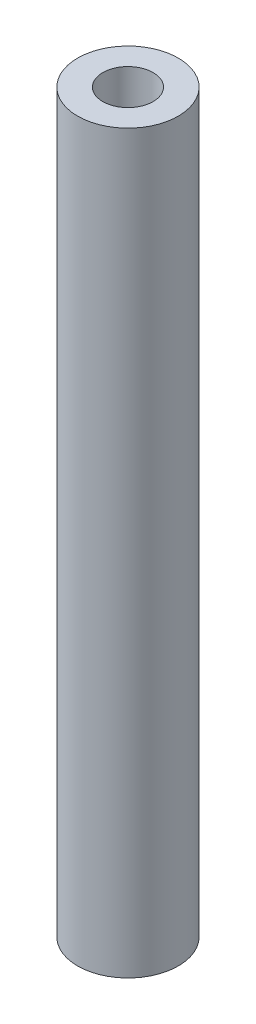
ISO-10303-21;
HEADER;
FILE_DESCRIPTION(('STEP AP214'),'2;1');
FILE_NAME('part.step','',(''),(''),'','','');
FILE_SCHEMA(('AUTOMOTIVE_DESIGN { 1 0 10303 214 1 1 1 1 }'));
ENDSEC;
DATA;
#1=APPLICATION_CONTEXT('core data for automotive mechanical design processes');
#2=APPLICATION_PROTOCOL_DEFINITION('international standard','automotive_design',2000,#1);
#3=PRODUCT_CONTEXT('',#1,'mechanical');
#4=PRODUCT('Part','Part','',(#3));
#5=PRODUCT_RELATED_PRODUCT_CATEGORY('part','',(#4));
#6=PRODUCT_DEFINITION_FORMATION('','',#4);
#7=PRODUCT_DEFINITION_CONTEXT('part definition',#1,'design');
#8=PRODUCT_DEFINITION('design','',#6,#7);
#9=PRODUCT_DEFINITION_SHAPE('','',#8);
#10=(LENGTH_UNIT() NAMED_UNIT(*) SI_UNIT(.MILLI.,.METRE.));
#11=(NAMED_UNIT(*) PLANE_ANGLE_UNIT() SI_UNIT($,.RADIAN.));
#12=(NAMED_UNIT(*) SI_UNIT($,.STERADIAN.) SOLID_ANGLE_UNIT());
#13=UNCERTAINTY_MEASURE_WITH_UNIT(LENGTH_MEASURE(1.E-05),#10,'distance_accuracy_value','');
#14=(GEOMETRIC_REPRESENTATION_CONTEXT(3) GLOBAL_UNCERTAINTY_ASSIGNED_CONTEXT((#13)) GLOBAL_UNIT_ASSIGNED_CONTEXT((#10,
#11,#12)) REPRESENTATION_CONTEXT('',''));
#15=CARTESIAN_POINT('',(0.,0.,0.));
#16=DIRECTION('',(0.,0.,1.));
#17=DIRECTION('',(1.,0.,0.));
#18=AXIS2_PLACEMENT_3D('',#15,#16,#17);
#19=CARTESIAN_POINT('',(0.,58.5,0.));
#20=DIRECTION('',(0.,1.,0.));
#21=DIRECTION('',(0.,0.,1.));
#22=AXIS2_PLACEMENT_3D('',#19,#20,#21);
#23=PLANE('',#22);
#24=CARTESIAN_POINT('',(0.,58.5,0.));
#25=DIRECTION('',(0.,1.,0.));
#26=DIRECTION('',(0.,0.,1.));
#27=AXIS2_PLACEMENT_3D('',#24,#25,#26);
#28=CIRCLE('',#27,4.);
#29=CARTESIAN_POINT('',(0.,58.5,4.));
#30=VERTEX_POINT('',#29);
#31=EDGE_CURVE('E10',#30,#30,#28,.T.);
#32=ORIENTED_EDGE('',*,*,#31,.T.);
#33=EDGE_LOOP('',(#32));
#34=FACE_BOUND('',#33,.T.);
#35=CARTESIAN_POINT('',(0.,58.5,0.));
#36=DIRECTION('',(0.,1.,0.));
#37=DIRECTION('',(0.,0.,1.));
#38=AXIS2_PLACEMENT_3D('',#35,#36,#37);
#39=CIRCLE('',#38,2.);
#40=CARTESIAN_POINT('',(0.,58.5,2.));
#41=VERTEX_POINT('',#40);
#42=EDGE_CURVE('E45',#41,#41,#39,.T.);
#43=ORIENTED_EDGE('',*,*,#42,.F.);
#44=EDGE_LOOP('',(#43));
#45=FACE_BOUND('',#44,.T.);
#46=ADVANCED_FACE('F34',(#34,#45),#23,.T.);
#47=CARTESIAN_POINT('',(0.,0.,0.));
#48=DIRECTION('',(0.,1.,0.));
#49=DIRECTION('',(0.,0.,1.));
#50=AXIS2_PLACEMENT_3D('',#47,#48,#49);
#51=PLANE('',#50);
#52=CARTESIAN_POINT('',(0.,0.,0.));
#53=DIRECTION('',(0.,1.,0.));
#54=DIRECTION('',(0.,0.,1.));
#55=AXIS2_PLACEMENT_3D('',#52,#53,#54);
#56=CIRCLE('',#55,4.);
#57=CARTESIAN_POINT('',(0.,0.,4.));
#58=VERTEX_POINT('',#57);
#59=EDGE_CURVE('E38',#58,#58,#56,.T.);
#60=ORIENTED_EDGE('',*,*,#59,.F.);
#61=EDGE_LOOP('',(#60));
#62=FACE_BOUND('',#61,.T.);
#63=CARTESIAN_POINT('',(0.,0.,0.));
#64=DIRECTION('',(0.,1.,0.));
#65=DIRECTION('',(0.,0.,1.));
#66=AXIS2_PLACEMENT_3D('',#63,#64,#65);
#67=CIRCLE('',#66,2.);
#68=CARTESIAN_POINT('',(0.,0.,2.));
#69=VERTEX_POINT('',#68);
#70=EDGE_CURVE('E47',#69,#69,#67,.T.);
#71=ORIENTED_EDGE('',*,*,#70,.T.);
#72=EDGE_LOOP('',(#71));
#73=FACE_BOUND('',#72,.T.);
#74=ADVANCED_FACE('F57',(#62,#73),#51,.F.);
#75=CARTESIAN_POINT('',(0.,58.5,0.));
#76=DIRECTION('',(0.,-1.,0.));
#77=DIRECTION('',(0.,0.,-1.));
#78=AXIS2_PLACEMENT_3D('',#75,#76,#77);
#79=CYLINDRICAL_SURFACE('',#78,4.);
#80=ORIENTED_EDGE('',*,*,#31,.F.);
#81=EDGE_LOOP('',(#80));
#82=FACE_BOUND('',#81,.T.);
#83=ORIENTED_EDGE('',*,*,#59,.T.);
#84=EDGE_LOOP('',(#83));
#85=FACE_BOUND('',#84,.T.);
#86=ADVANCED_FACE('F36',(#82,#85),#79,.T.);
#87=CARTESIAN_POINT('',(0.,58.5,0.));
#88=DIRECTION('',(0.,-1.,0.));
#89=DIRECTION('',(0.,0.,-1.));
#90=AXIS2_PLACEMENT_3D('',#87,#88,#89);
#91=CYLINDRICAL_SURFACE('',#90,2.);
#92=ORIENTED_EDGE('',*,*,#42,.T.);
#93=EDGE_LOOP('',(#92));
#94=FACE_BOUND('',#93,.T.);
#95=ORIENTED_EDGE('',*,*,#70,.F.);
#96=EDGE_LOOP('',(#95));
#97=FACE_BOUND('',#96,.T.);
#98=ADVANCED_FACE('F53',(#94,#97),#91,.F.);
#99=CLOSED_SHELL('',(#46,#74,#86,#98));
#100=MANIFOLD_SOLID_BREP('B2',#99);
#101=ADVANCED_BREP_SHAPE_REPRESENTATION('',(#18,#100),#14);
#102=SHAPE_DEFINITION_REPRESENTATION(#9,#101);
ENDSEC;
END-ISO-10303-21;
